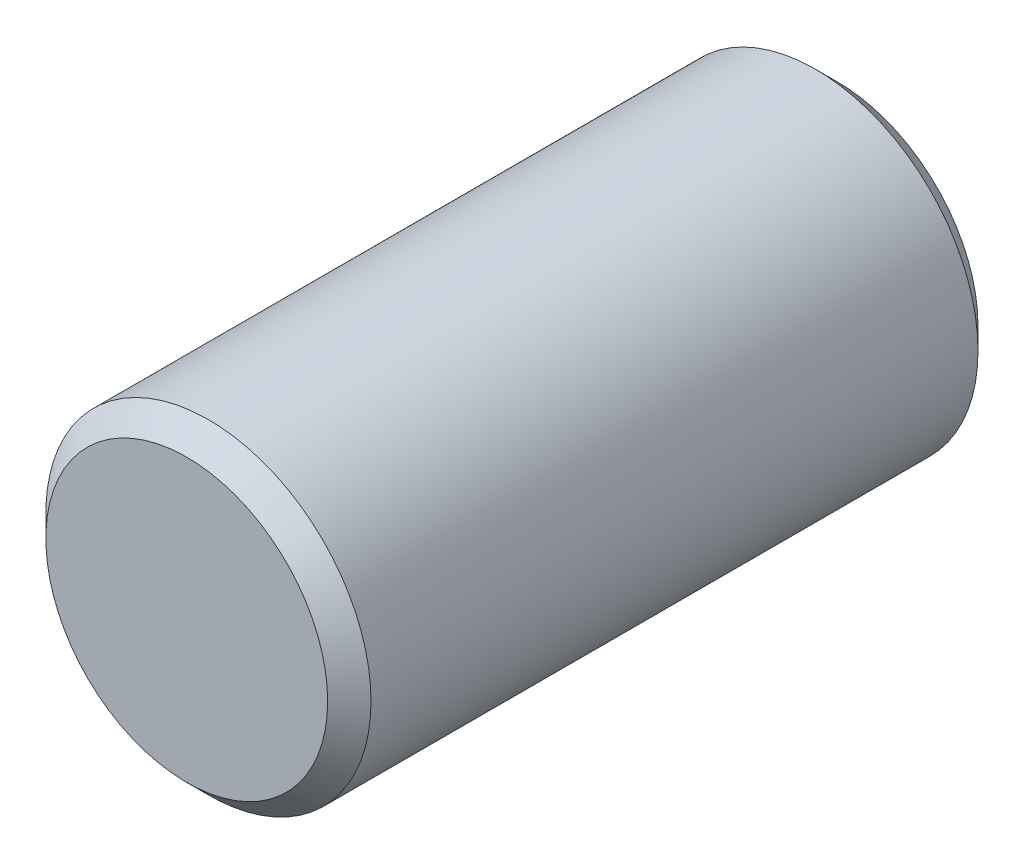
ISO-10303-21;
HEADER;
FILE_DESCRIPTION(('STEP AP214'),'2;1');
FILE_NAME('part.step','',(''),(''),'','','');
FILE_SCHEMA(('AUTOMOTIVE_DESIGN { 1 0 10303 214 1 1 1 1 }'));
ENDSEC;
DATA;
#1=APPLICATION_CONTEXT('core data for automotive mechanical design processes');
#2=APPLICATION_PROTOCOL_DEFINITION('international standard','automotive_design',2000,#1);
#3=PRODUCT_CONTEXT('',#1,'mechanical');
#4=PRODUCT('Part','Part','',(#3));
#5=PRODUCT_RELATED_PRODUCT_CATEGORY('part','',(#4));
#6=PRODUCT_DEFINITION_FORMATION('','',#4);
#7=PRODUCT_DEFINITION_CONTEXT('part definition',#1,'design');
#8=PRODUCT_DEFINITION('design','',#6,#7);
#9=PRODUCT_DEFINITION_SHAPE('','',#8);
#10=(LENGTH_UNIT() NAMED_UNIT(*) SI_UNIT(.MILLI.,.METRE.));
#11=(NAMED_UNIT(*) PLANE_ANGLE_UNIT() SI_UNIT($,.RADIAN.));
#12=(NAMED_UNIT(*) SI_UNIT($,.STERADIAN.) SOLID_ANGLE_UNIT());
#13=UNCERTAINTY_MEASURE_WITH_UNIT(LENGTH_MEASURE(1.E-05),#10,'distance_accuracy_value','');
#14=(GEOMETRIC_REPRESENTATION_CONTEXT(3) GLOBAL_UNCERTAINTY_ASSIGNED_CONTEXT((#13)) GLOBAL_UNIT_ASSIGNED_CONTEXT((#10,
#11,#12)) REPRESENTATION_CONTEXT('',''));
#15=CARTESIAN_POINT('',(0.,0.,0.));
#16=DIRECTION('',(0.,0.,1.));
#17=DIRECTION('',(1.,0.,0.));
#18=AXIS2_PLACEMENT_3D('',#15,#16,#17);
#19=CARTESIAN_POINT('',(0.,0.,1.5));
#20=DIRECTION('',(0.,0.,-1.));
#21=DIRECTION('',(-1.,0.,0.));
#22=AXIS2_PLACEMENT_3D('',#19,#20,#21);
#23=CYLINDRICAL_SURFACE('',#22,0.75);
#24=CARTESIAN_POINT('',(0.,0.,-1.4));
#25=DIRECTION('',(0.,0.,1.));
#26=DIRECTION('',(1.,0.,0.));
#27=AXIS2_PLACEMENT_3D('',#24,#25,#26);
#28=CIRCLE('',#27,0.75);
#29=CARTESIAN_POINT('',(0.75,0.,-1.4));
#30=VERTEX_POINT('',#29);
#31=EDGE_CURVE('E42',#30,#30,#28,.T.);
#32=ORIENTED_EDGE('',*,*,#31,.T.);
#33=EDGE_LOOP('',(#32));
#34=FACE_BOUND('',#33,.T.);
#35=CARTESIAN_POINT('',(0.,0.,1.4));
#36=DIRECTION('',(0.,0.,1.));
#37=DIRECTION('',(1.,0.,0.));
#38=AXIS2_PLACEMENT_3D('',#35,#36,#37);
#39=CIRCLE('',#38,0.75);
#40=CARTESIAN_POINT('',(0.75,0.,1.4));
#41=VERTEX_POINT('',#40);
#42=EDGE_CURVE('E46',#41,#41,#39,.F.);
#43=ORIENTED_EDGE('',*,*,#42,.T.);
#44=EDGE_LOOP('',(#43));
#45=FACE_BOUND('',#44,.T.);
#46=ADVANCED_FACE('F31',(#34,#45),#23,.T.);
#47=CARTESIAN_POINT('',(0.,0.,1.5));
#48=DIRECTION('',(0.,0.,1.));
#49=DIRECTION('',(1.,0.,0.));
#50=AXIS2_PLACEMENT_3D('',#47,#48,#49);
#51=PLANE('',#50);
#52=CARTESIAN_POINT('',(0.,0.,1.5));
#53=DIRECTION('',(0.,0.,1.));
#54=DIRECTION('',(1.,0.,0.));
#55=AXIS2_PLACEMENT_3D('',#52,#53,#54);
#56=CIRCLE('',#55,0.65);
#57=CARTESIAN_POINT('',(0.65,0.,1.5));
#58=VERTEX_POINT('',#57);
#59=EDGE_CURVE('E10',#58,#58,#56,.T.);
#60=ORIENTED_EDGE('',*,*,#59,.T.);
#61=EDGE_LOOP('',(#60));
#62=FACE_BOUND('',#61,.T.);
#63=ADVANCED_FACE('F62',(#62),#51,.T.);
#64=CARTESIAN_POINT('',(0.,0.,-1.5));
#65=DIRECTION('',(0.,0.,1.));
#66=DIRECTION('',(1.,0.,0.));
#67=AXIS2_PLACEMENT_3D('',#64,#65,#66);
#68=PLANE('',#67);
#69=CARTESIAN_POINT('',(0.,0.,-1.5));
#70=DIRECTION('',(0.,0.,1.));
#71=DIRECTION('',(1.,0.,0.));
#72=AXIS2_PLACEMENT_3D('',#69,#70,#71);
#73=CIRCLE('',#72,0.65);
#74=CARTESIAN_POINT('',(0.65,0.,-1.5));
#75=VERTEX_POINT('',#74);
#76=EDGE_CURVE('E38',#75,#75,#73,.F.);
#77=ORIENTED_EDGE('',*,*,#76,.T.);
#78=EDGE_LOOP('',(#77));
#79=FACE_BOUND('',#78,.T.);
#80=ADVANCED_FACE('F59',(#79),#68,.F.);
#81=CARTESIAN_POINT('',(0.,0.,-1.4));
#82=DIRECTION('',(0.,0.,1.));
#83=DIRECTION('',(1.,0.,0.));
#84=AXIS2_PLACEMENT_3D('',#81,#82,#83);
#85=CONICAL_SURFACE('',#84,0.75,0.785398163397451);
#86=ORIENTED_EDGE('',*,*,#76,.F.);
#87=EDGE_LOOP('',(#86));
#88=FACE_BOUND('',#87,.T.);
#89=ORIENTED_EDGE('',*,*,#31,.F.);
#90=EDGE_LOOP('',(#89));
#91=FACE_BOUND('',#90,.T.);
#92=ADVANCED_FACE('F55',(#88,#91),#85,.T.);
#93=CARTESIAN_POINT('',(0.,0.,1.5));
#94=DIRECTION('',(0.,0.,-1.));
#95=DIRECTION('',(-1.,0.,0.));
#96=AXIS2_PLACEMENT_3D('',#93,#94,#95);
#97=CONICAL_SURFACE('',#96,0.65,0.785398163397447);
#98=ORIENTED_EDGE('',*,*,#42,.F.);
#99=EDGE_LOOP('',(#98));
#100=FACE_BOUND('',#99,.T.);
#101=ORIENTED_EDGE('',*,*,#59,.F.);
#102=EDGE_LOOP('',(#101));
#103=FACE_BOUND('',#102,.T.);
#104=ADVANCED_FACE('F33',(#100,#103),#97,.T.);
#105=CLOSED_SHELL('',(#46,#63,#80,#92,#104));
#106=MANIFOLD_SOLID_BREP('B2',#105);
#107=ADVANCED_BREP_SHAPE_REPRESENTATION('',(#18,#106),#14);
#108=SHAPE_DEFINITION_REPRESENTATION(#9,#107);
ENDSEC;
END-ISO-10303-21;
